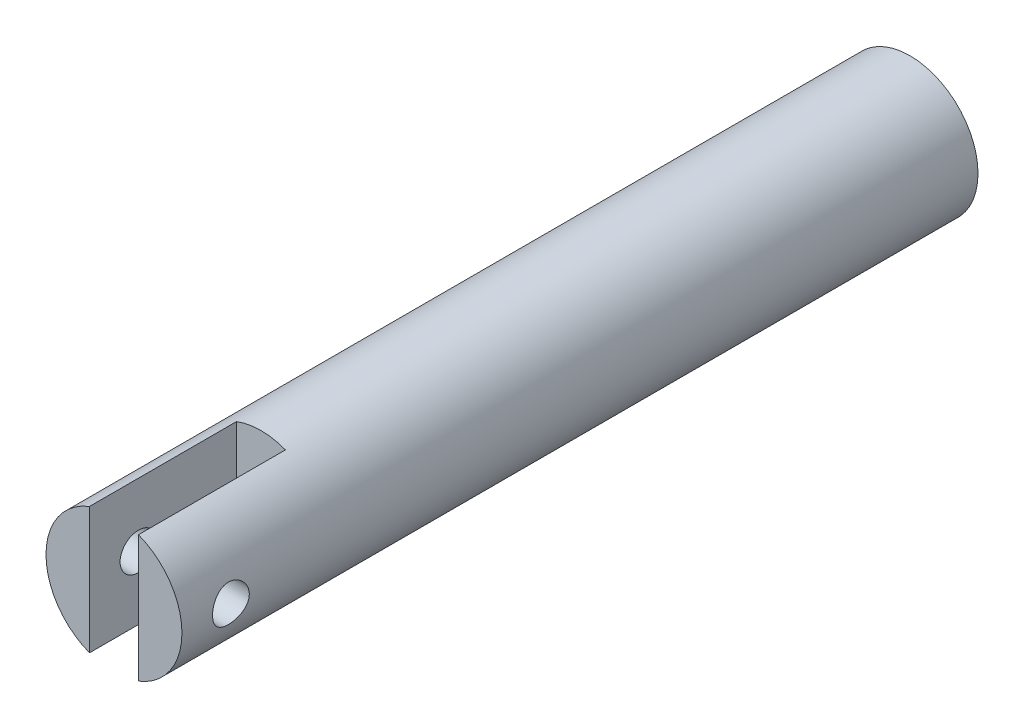
ISO-10303-21;
HEADER;
FILE_DESCRIPTION(('STEP AP214'),'2;1');
FILE_NAME('part.step','',(''),(''),'','','');
FILE_SCHEMA(('AUTOMOTIVE_DESIGN { 1 0 10303 214 1 1 1 1 }'));
ENDSEC;
DATA;
#1=APPLICATION_CONTEXT('core data for automotive mechanical design processes');
#2=APPLICATION_PROTOCOL_DEFINITION('international standard','automotive_design',2000,#1);
#3=PRODUCT_CONTEXT('',#1,'mechanical');
#4=PRODUCT('Part','Part','',(#3));
#5=PRODUCT_RELATED_PRODUCT_CATEGORY('part','',(#4));
#6=PRODUCT_DEFINITION_FORMATION('','',#4);
#7=PRODUCT_DEFINITION_CONTEXT('part definition',#1,'design');
#8=PRODUCT_DEFINITION('design','',#6,#7);
#9=PRODUCT_DEFINITION_SHAPE('','',#8);
#10=(LENGTH_UNIT() NAMED_UNIT(*) SI_UNIT(.MILLI.,.METRE.));
#11=(NAMED_UNIT(*) PLANE_ANGLE_UNIT() SI_UNIT($,.RADIAN.));
#12=(NAMED_UNIT(*) SI_UNIT($,.STERADIAN.) SOLID_ANGLE_UNIT());
#13=UNCERTAINTY_MEASURE_WITH_UNIT(LENGTH_MEASURE(1.E-05),#10,'distance_accuracy_value','');
#14=(GEOMETRIC_REPRESENTATION_CONTEXT(3) GLOBAL_UNCERTAINTY_ASSIGNED_CONTEXT((#13)) GLOBAL_UNIT_ASSIGNED_CONTEXT((#10,
#11,#12)) REPRESENTATION_CONTEXT('',''));
#15=CARTESIAN_POINT('',(0.,0.,0.));
#16=DIRECTION('',(0.,0.,1.));
#17=DIRECTION('',(1.,0.,0.));
#18=AXIS2_PLACEMENT_3D('',#15,#16,#17);
#19=CARTESIAN_POINT('',(0.,0.,65.));
#20=DIRECTION('',(0.,0.,1.));
#21=DIRECTION('',(1.,0.,0.));
#22=AXIS2_PLACEMENT_3D('',#19,#20,#21);
#23=PLANE('',#22);
#24=DIRECTION('',(0.,-1.,0.));
#25=VECTOR('',#24,1.);
#26=CARTESIAN_POINT('',(-2.,5.17711309515255,65.));
#27=LINE('',#26,#25);
#28=CARTESIAN_POINT('',(-2.,5.17711309515255,65.));
#29=VERTEX_POINT('',#28);
#30=CARTESIAN_POINT('',(-2.,-5.17711309515255,65.));
#31=VERTEX_POINT('',#30);
#32=EDGE_CURVE('E73',#29,#31,#27,.T.);
#33=ORIENTED_EDGE('',*,*,#32,.F.);
#34=CARTESIAN_POINT('',(0.,0.,65.));
#35=DIRECTION('',(0.,0.,1.));
#36=DIRECTION('',(1.,0.,0.));
#37=AXIS2_PLACEMENT_3D('',#34,#35,#36);
#38=CIRCLE('',#37,5.55);
#39=EDGE_CURVE('E11',#29,#31,#38,.T.);
#40=ORIENTED_EDGE('',*,*,#39,.T.);
#41=EDGE_LOOP('',(#33,#40));
#42=FACE_BOUND('',#41,.T.);
#43=ADVANCED_FACE('F32',(#42),#23,.T.);
#44=CARTESIAN_POINT('',(0.,0.,65.));
#45=DIRECTION('',(0.,0.,-1.));
#46=DIRECTION('',(-1.,0.,0.));
#47=AXIS2_PLACEMENT_3D('',#44,#45,#46);
#48=CYLINDRICAL_SURFACE('',#47,5.55);
#49=CARTESIAN_POINT('',(-5.55,0.,59.5));
#50=CARTESIAN_POINT('',(-5.54999879615194,0.0826494633927154,59.5000018746962));
#51=CARTESIAN_POINT('',(-5.54813568532362,0.165318848419868,59.506853812904));
#52=CARTESIAN_POINT('',(-5.54088440898738,0.328273451632411,59.5340303315248));
#53=CARTESIAN_POINT('',(-5.53549461428784,0.408557549979276,59.5543611387117));
#54=CARTESIAN_POINT('',(-5.52178442124985,0.564366049193908,59.6077840939381));
#55=CARTESIAN_POINT('',(-5.51346785987332,0.639896529910036,59.6408595392463));
#56=CARTESIAN_POINT('',(-5.49478153503013,0.784338444058895,59.7187702709216));
#57=CARTESIAN_POINT('',(-5.48441162002809,0.85324938841894,59.7636064252962));
#58=CARTESIAN_POINT('',(-5.46246127093075,0.984133559937081,59.8648904757167));
#59=CARTESIAN_POINT('',(-5.45085970647635,1.04592709324454,59.9215660045104));
#60=CARTESIAN_POINT('',(-5.42788828388297,1.15925819722945,60.0444335444044));
#61=CARTESIAN_POINT('',(-5.41651845661983,1.21079440917286,60.1106268142728));
#62=CARTESIAN_POINT('',(-5.39508096210617,1.30303115342026,60.2520939917978));
#63=CARTESIAN_POINT('',(-5.38503991518082,1.34352367385294,60.3275079287304));
#64=CARTESIAN_POINT('',(-5.36770808081144,1.41118330571831,60.4843887684982));
#65=CARTESIAN_POINT('',(-5.36041677093315,1.43835294871614,60.5658545179994));
#66=CARTESIAN_POINT('',(-5.34962833164668,1.47796903905552,60.7305333611906));
#67=CARTESIAN_POINT('',(-5.34604724875154,1.49074186800391,60.8136623033563));
#68=CARTESIAN_POINT('',(-5.34283400169016,1.50221948422755,60.9809542865722));
#69=CARTESIAN_POINT('',(-5.34320107787369,1.50092697775977,61.0651171255816));
#70=CARTESIAN_POINT('',(-5.34776761089798,1.48456944039451,61.2295297086572));
#71=CARTESIAN_POINT('',(-5.35185678021551,1.46990073062952,61.3098224354498));
#72=CARTESIAN_POINT('',(-5.36322997341351,1.42784250780183,61.4667624758096));
#73=CARTESIAN_POINT('',(-5.37051425881699,1.40045195343429,61.5434094904027));
#74=CARTESIAN_POINT('',(-5.38755296870838,1.3334078704218,61.6919088355209));
#75=CARTESIAN_POINT('',(-5.39733492625185,1.29361648626527,61.7636956347143));
#76=CARTESIAN_POINT('',(-5.41825216289466,1.20299640255253,61.8997117370747));
#77=CARTESIAN_POINT('',(-5.429387714712,1.1521654771554,61.9639395121253));
#78=CARTESIAN_POINT('',(-5.45221531507438,1.03888875462571,62.0852771073868));
#79=CARTESIAN_POINT('',(-5.46391350077369,0.976110532435758,62.1420758788547));
#80=CARTESIAN_POINT('',(-5.48621371709655,0.841776678813462,62.2444039738118));
#81=CARTESIAN_POINT('',(-5.49681570215022,0.770220682752514,62.2899328289116));
#82=CARTESIAN_POINT('',(-5.51579714245651,0.619872258080171,62.3685708376427));
#83=CARTESIAN_POINT('',(-5.5241662411197,0.541048315268525,62.4016224029782));
#84=CARTESIAN_POINT('',(-5.53766413798729,0.37868461864081,62.4539145573887));
#85=CARTESIAN_POINT('',(-5.54279366413402,0.295145928842746,62.4731582492697));
#86=CARTESIAN_POINT('',(-5.54912384681125,0.128377573772656,62.4967970008638));
#87=CARTESIAN_POINT('',(-5.5504363277452,0.0452119855218677,62.5016148108581));
#88=CARTESIAN_POINT('',(-5.54930671534324,-0.120739317200337,62.4974343088602));
#89=CARTESIAN_POINT('',(-5.54686502145572,-0.203525071146549,62.4884374667625));
#90=CARTESIAN_POINT('',(-5.53857375333191,-0.364848942531915,62.4572293591669));
#91=CARTESIAN_POINT('',(-5.53278532499192,-0.443436330325438,62.435255045592));
#92=CARTESIAN_POINT('',(-5.51845832017505,-0.595800840535774,62.378991941288));
#93=CARTESIAN_POINT('',(-5.50991944162924,-0.669577433535165,62.3447017979219));
#94=CARTESIAN_POINT('',(-5.49077807060945,-0.811859862642032,62.2640040455767));
#95=CARTESIAN_POINT('',(-5.48013775012766,-0.880230910060631,62.2173679825496));
#96=CARTESIAN_POINT('',(-5.45802286326308,-1.00832472838278,62.1135883880366));
#97=CARTESIAN_POINT('',(-5.44654812774349,-1.06804573853389,62.0564427226339));
#98=CARTESIAN_POINT('',(-5.42364433808291,-1.17893417351261,61.9312913887765));
#99=CARTESIAN_POINT('',(-5.41222627781712,-1.22980300036862,61.8630186397425));
#100=CARTESIAN_POINT('',(-5.39109349586186,-1.31936978116537,61.7186634174368));
#101=CARTESIAN_POINT('',(-5.38137870475979,-1.35806823113139,61.6425812626188));
#102=CARTESIAN_POINT('',(-5.3648647316121,-1.42190514266968,61.4851369239655));
#103=CARTESIAN_POINT('',(-5.35804890811988,-1.44712122035433,61.4038080506478));
#104=CARTESIAN_POINT('',(-5.34810458208024,-1.48345508406507,61.2378480302932));
#105=CARTESIAN_POINT('',(-5.34497510580962,-1.49457659313316,61.1532177614018));
#106=CARTESIAN_POINT('',(-5.34284070068284,-1.50218723372163,60.9861187129008));
#107=CARTESIAN_POINT('',(-5.3437003024775,-1.49915693877548,60.9036732285872));
#108=CARTESIAN_POINT('',(-5.34912914015623,-1.47966808775349,60.7405157803563));
#109=CARTESIAN_POINT('',(-5.35369827560105,-1.463209895251,60.6598037695642));
#110=CARTESIAN_POINT('',(-5.36594961229916,-1.4176145187469,60.5030277270834));
#111=CARTESIAN_POINT('',(-5.37360613355019,-1.38858178212087,60.426931170208));
#112=CARTESIAN_POINT('',(-5.39116955463475,-1.3187424295426,60.2806309729558));
#113=CARTESIAN_POINT('',(-5.40107681611949,-1.27793392116245,60.2104282820968));
#114=CARTESIAN_POINT('',(-5.42239869846201,-1.18425604648313,60.0756211641228));
#115=CARTESIAN_POINT('',(-5.43384977433815,-1.13105999285312,60.0112494924036));
#116=CARTESIAN_POINT('',(-5.45676839722498,-1.01473492702236,59.8921904291386));
#117=CARTESIAN_POINT('',(-5.46823594757932,-0.951603488480783,59.8375054101423));
#118=CARTESIAN_POINT('',(-5.49019935014915,-0.815512191776865,59.7381791110337));
#119=CARTESIAN_POINT('',(-5.5006680449896,-0.742365569701441,59.6937871970298));
#120=CARTESIAN_POINT('',(-5.51915451258881,-0.589366695549458,59.6179997935478));
#121=CARTESIAN_POINT('',(-5.52717381491222,-0.509518668160427,59.5865961889431));
#122=CARTESIAN_POINT('',(-5.53885482984226,-0.358337261031642,59.5416438492013));
#123=CARTESIAN_POINT('',(-5.54300340741267,-0.287638783374459,59.5260642669616));
#124=CARTESIAN_POINT('',(-5.54857637665883,-0.144631842519288,59.5052420630478));
#125=CARTESIAN_POINT('',(-5.55000105344379,-0.0723235486214627,59.4999983595213));
#126=CARTESIAN_POINT('',(-5.55,0.,59.5));
#127=B_SPLINE_CURVE_WITH_KNOTS('',3,(#49,#50,#51,#52,#53,#54,#55,#56,#57,#58,#59,#60,#61,#62,
#63,#64,#65,#66,#67,#68,#69,#70,#71,#72,#73,#74,#75,#76,#77,#78,#79,#80,#81,#82,#83,#84,#85,#86,
#87,#88,#89,#90,#91,#92,#93,#94,#95,#96,#97,#98,#99,#100,#101,#102,#103,#104,#105,#106,#107,
#108,#109,#110,#111,#112,#113,#114,#115,#116,#117,#118,#119,#120,#121,#122,#123,#124,#125,#126),
.UNSPECIFIED.,.T.,.F.,(4,2,2,2,2,2,2,2,2,2,2,2,2,2,2,2,2,2,2,2,2,2,2,2,2,2,2,2,2,2,2,2,2,2,2,2,
2,2,4),(0.,0.247683117479802,0.495480735843709,0.742954696811896,0.990446927913596,
1.24322718642299,1.49604090716615,1.75333091968523,2.01057202392053,2.26185607755089,
2.51309178343998,2.75711729570227,3.0011627853929,3.24802431731499,3.49493566883073,
3.75012973834969,4.00533441221877,4.26170297346541,4.51801390735887,4.76673633023641,
5.01543229060086,5.25972195861126,5.50403846495144,5.75323722720833,6.00248664387578,
6.25897090131834,6.51544470393504,6.77042567663096,7.02533928274809,7.27166059273816,
7.51797523356144,7.76228202195334,8.0066280936063,8.2583449745939,8.51012342354435,
8.76748013023476,9.02467579604023,9.24143700090325,9.45817551624786),.UNSPECIFIED.);
#128=CARTESIAN_POINT('',(-5.55,0.,59.5));
#129=VERTEX_POINT('',#128);
#130=EDGE_CURVE('E104',#129,#129,#127,.T.);
#131=ORIENTED_EDGE('',*,*,#130,.T.);
#132=EDGE_LOOP('',(#131));
#133=FACE_BOUND('',#132,.T.);
#134=CARTESIAN_POINT('',(5.55,0.,59.5));
#135=CARTESIAN_POINT('',(5.54999879615194,-0.0826494633927154,59.5000018746962));
#136=CARTESIAN_POINT('',(5.54813568532362,-0.165318848419868,59.506853812904));
#137=CARTESIAN_POINT('',(5.54088440898738,-0.328273451632411,59.5340303315248));
#138=CARTESIAN_POINT('',(5.53549461428784,-0.408557549979276,59.5543611387117));
#139=CARTESIAN_POINT('',(5.52178442124985,-0.564366049193908,59.6077840939381));
#140=CARTESIAN_POINT('',(5.51346785987332,-0.639896529910036,59.6408595392463));
#141=CARTESIAN_POINT('',(5.49478153503013,-0.784338444058895,59.7187702709216));
#142=CARTESIAN_POINT('',(5.48441162002809,-0.85324938841894,59.7636064252962));
#143=CARTESIAN_POINT('',(5.46246127093075,-0.984133559937081,59.8648904757167));
#144=CARTESIAN_POINT('',(5.45085970647635,-1.04592709324454,59.9215660045104));
#145=CARTESIAN_POINT('',(5.42788828388297,-1.15925819722945,60.0444335444044));
#146=CARTESIAN_POINT('',(5.41651845661983,-1.21079440917286,60.1106268142728));
#147=CARTESIAN_POINT('',(5.39508096210617,-1.30303115342026,60.2520939917978));
#148=CARTESIAN_POINT('',(5.38503991518082,-1.34352367385294,60.3275079287304));
#149=CARTESIAN_POINT('',(5.36770808081144,-1.41118330571831,60.4843887684982));
#150=CARTESIAN_POINT('',(5.36041677093315,-1.43835294871614,60.5658545179994));
#151=CARTESIAN_POINT('',(5.34962833164668,-1.47796903905552,60.7305333611906));
#152=CARTESIAN_POINT('',(5.34604724875154,-1.49074186800391,60.8136623033563));
#153=CARTESIAN_POINT('',(5.34283400169016,-1.50221948422755,60.9809542865722));
#154=CARTESIAN_POINT('',(5.34320107787369,-1.50092697775977,61.0651171255816));
#155=CARTESIAN_POINT('',(5.34776761089798,-1.48456944039451,61.2295297086572));
#156=CARTESIAN_POINT('',(5.35185678021551,-1.46990073062952,61.3098224354498));
#157=CARTESIAN_POINT('',(5.36322997341351,-1.42784250780183,61.4667624758096));
#158=CARTESIAN_POINT('',(5.37051425881699,-1.40045195343429,61.5434094904027));
#159=CARTESIAN_POINT('',(5.38755296870838,-1.3334078704218,61.6919088355209));
#160=CARTESIAN_POINT('',(5.39733492625185,-1.29361648626527,61.7636956347143));
#161=CARTESIAN_POINT('',(5.41825216289466,-1.20299640255253,61.8997117370747));
#162=CARTESIAN_POINT('',(5.429387714712,-1.1521654771554,61.9639395121253));
#163=CARTESIAN_POINT('',(5.45221531507438,-1.03888875462571,62.0852771073868));
#164=CARTESIAN_POINT('',(5.46391350077369,-0.976110532435758,62.1420758788547));
#165=CARTESIAN_POINT('',(5.48621371709655,-0.841776678813462,62.2444039738118));
#166=CARTESIAN_POINT('',(5.49681570215022,-0.770220682752514,62.2899328289116));
#167=CARTESIAN_POINT('',(5.51579714245651,-0.619872258080171,62.3685708376427));
#168=CARTESIAN_POINT('',(5.5241662411197,-0.541048315268525,62.4016224029782));
#169=CARTESIAN_POINT('',(5.53766413798729,-0.37868461864081,62.4539145573887));
#170=CARTESIAN_POINT('',(5.54279366413402,-0.295145928842746,62.4731582492697));
#171=CARTESIAN_POINT('',(5.54912384681125,-0.128377573772656,62.4967970008638));
#172=CARTESIAN_POINT('',(5.5504363277452,-0.0452119855218677,62.5016148108581));
#173=CARTESIAN_POINT('',(5.54930671534324,0.120739317200337,62.4974343088602));
#174=CARTESIAN_POINT('',(5.54686502145572,0.203525071146549,62.4884374667625));
#175=CARTESIAN_POINT('',(5.53857375333191,0.364848942531915,62.4572293591669));
#176=CARTESIAN_POINT('',(5.53278532499192,0.443436330325438,62.435255045592));
#177=CARTESIAN_POINT('',(5.51845832017505,0.595800840535774,62.378991941288));
#178=CARTESIAN_POINT('',(5.50991944162924,0.669577433535165,62.3447017979219));
#179=CARTESIAN_POINT('',(5.49077807060945,0.811859862642032,62.2640040455767));
#180=CARTESIAN_POINT('',(5.48013775012766,0.880230910060631,62.2173679825496));
#181=CARTESIAN_POINT('',(5.45802286326308,1.00832472838278,62.1135883880366));
#182=CARTESIAN_POINT('',(5.44654812774349,1.06804573853389,62.0564427226339));
#183=CARTESIAN_POINT('',(5.42364433808291,1.17893417351261,61.9312913887765));
#184=CARTESIAN_POINT('',(5.41222627781712,1.22980300036862,61.8630186397425));
#185=CARTESIAN_POINT('',(5.39109349586186,1.31936978116537,61.7186634174368));
#186=CARTESIAN_POINT('',(5.38137870475979,1.35806823113139,61.6425812626188));
#187=CARTESIAN_POINT('',(5.3648647316121,1.42190514266968,61.4851369239655));
#188=CARTESIAN_POINT('',(5.35804890811988,1.44712122035433,61.4038080506478));
#189=CARTESIAN_POINT('',(5.34810458208024,1.48345508406507,61.2378480302932));
#190=CARTESIAN_POINT('',(5.34497510580962,1.49457659313316,61.1532177614018));
#191=CARTESIAN_POINT('',(5.34284070068284,1.50218723372163,60.9861187129008));
#192=CARTESIAN_POINT('',(5.3437003024775,1.49915693877548,60.9036732285872));
#193=CARTESIAN_POINT('',(5.34912914015623,1.47966808775349,60.7405157803563));
#194=CARTESIAN_POINT('',(5.35369827560105,1.463209895251,60.6598037695642));
#195=CARTESIAN_POINT('',(5.36594961229916,1.4176145187469,60.5030277270834));
#196=CARTESIAN_POINT('',(5.37360613355019,1.38858178212087,60.426931170208));
#197=CARTESIAN_POINT('',(5.39116955463475,1.3187424295426,60.2806309729558));
#198=CARTESIAN_POINT('',(5.40107681611949,1.27793392116245,60.2104282820968));
#199=CARTESIAN_POINT('',(5.42239869846201,1.18425604648313,60.0756211641228));
#200=CARTESIAN_POINT('',(5.43384977433815,1.13105999285312,60.0112494924036));
#201=CARTESIAN_POINT('',(5.45676839722498,1.01473492702236,59.8921904291386));
#202=CARTESIAN_POINT('',(5.46823594757932,0.951603488480783,59.8375054101423));
#203=CARTESIAN_POINT('',(5.49019935014915,0.815512191776865,59.7381791110337));
#204=CARTESIAN_POINT('',(5.5006680449896,0.742365569701441,59.6937871970298));
#205=CARTESIAN_POINT('',(5.51915451258881,0.589366695549458,59.6179997935478));
#206=CARTESIAN_POINT('',(5.52717381491222,0.509518668160427,59.5865961889431));
#207=CARTESIAN_POINT('',(5.53885482984226,0.358337261031642,59.5416438492013));
#208=CARTESIAN_POINT('',(5.54300340741267,0.287638783374459,59.5260642669616));
#209=CARTESIAN_POINT('',(5.54857637665883,0.144631842519288,59.5052420630478));
#210=CARTESIAN_POINT('',(5.55000105344379,0.0723235486214627,59.4999983595213));
#211=CARTESIAN_POINT('',(5.55,0.,59.5));
#212=B_SPLINE_CURVE_WITH_KNOTS('',3,(#134,#135,#136,#137,#138,#139,#140,#141,#142,#143,#144,
#145,#146,#147,#148,#149,#150,#151,#152,#153,#154,#155,#156,#157,#158,#159,#160,#161,#162,#163,
#164,#165,#166,#167,#168,#169,#170,#171,#172,#173,#174,#175,#176,#177,#178,#179,#180,#181,#182,
#183,#184,#185,#186,#187,#188,#189,#190,#191,#192,#193,#194,#195,#196,#197,#198,#199,#200,#201,
#202,#203,#204,#205,#206,#207,#208,#209,#210,#211),.UNSPECIFIED.,.T.,.F.,(4,2,2,2,2,2,2,2,2,2,2,
2,2,2,2,2,2,2,2,2,2,2,2,2,2,2,2,2,2,2,2,2,2,2,2,2,2,2,4),(0.,0.247683117479802,
0.495480735843709,0.742954696811896,0.990446927913596,1.24322718642299,1.49604090716615,
1.75333091968523,2.01057202392053,2.26185607755089,2.51309178343998,2.75711729570227,
3.0011627853929,3.24802431731499,3.49493566883073,3.75012973834969,4.00533441221877,
4.26170297346541,4.51801390735887,4.76673633023641,5.01543229060086,5.25972195861126,
5.50403846495144,5.75323722720833,6.00248664387578,6.25897090131834,6.51544470393504,
6.77042567663096,7.02533928274809,7.27166059273816,7.51797523356144,7.76228202195334,
8.0066280936063,8.2583449745939,8.51012342354435,8.76748013023476,9.02467579604023,
9.24143700090325,9.45817551624786),.UNSPECIFIED.);
#213=CARTESIAN_POINT('',(5.55,0.,59.5));
#214=VERTEX_POINT('',#213);
#215=EDGE_CURVE('E143',#214,#214,#212,.T.);
#216=ORIENTED_EDGE('',*,*,#215,.T.);
#217=EDGE_LOOP('',(#216));
#218=FACE_BOUND('',#217,.T.);
#219=ORIENTED_EDGE('',*,*,#39,.F.);
#220=DIRECTION('',(0.,0.,1.));
#221=VECTOR('',#220,1.);
#222=CARTESIAN_POINT('',(-2.,5.17711309515255,53.));
#223=LINE('',#222,#221);
#224=CARTESIAN_POINT('',(-2.,5.17711309515255,53.));
#225=VERTEX_POINT('',#224);
#226=EDGE_CURVE('E87',#225,#29,#223,.T.);
#227=ORIENTED_EDGE('',*,*,#226,.F.);
#228=CARTESIAN_POINT('',(0.,0.,53.));
#229=DIRECTION('',(0.,0.,1.));
#230=DIRECTION('',(1.,0.,0.));
#231=AXIS2_PLACEMENT_3D('',#228,#229,#230);
#232=CIRCLE('',#231,5.55);
#233=CARTESIAN_POINT('',(2.,5.17711309515255,53.));
#234=VERTEX_POINT('',#233);
#235=EDGE_CURVE('E91',#234,#225,#232,.T.);
#236=ORIENTED_EDGE('',*,*,#235,.F.);
#237=DIRECTION('',(0.,0.,1.));
#238=VECTOR('',#237,1.);
#239=CARTESIAN_POINT('',(2.,5.17711309515255,53.));
#240=LINE('',#239,#238);
#241=CARTESIAN_POINT('',(2.,5.17711309515255,65.));
#242=VERTEX_POINT('',#241);
#243=EDGE_CURVE('E80',#234,#242,#240,.T.);
#244=ORIENTED_EDGE('',*,*,#243,.T.);
#245=CARTESIAN_POINT('',(2.,-5.17711309515255,65.));
#246=VERTEX_POINT('',#245);
#247=EDGE_CURVE('E42',#246,#242,#38,.T.);
#248=ORIENTED_EDGE('',*,*,#247,.F.);
#249=DIRECTION('',(0.,0.,1.));
#250=VECTOR('',#249,1.);
#251=CARTESIAN_POINT('',(2.,-5.17711309515255,53.));
#252=LINE('',#251,#250);
#253=CARTESIAN_POINT('',(2.,-5.17711309515255,53.));
#254=VERTEX_POINT('',#253);
#255=EDGE_CURVE('E50',#254,#246,#252,.T.);
#256=ORIENTED_EDGE('',*,*,#255,.F.);
#257=CARTESIAN_POINT('',(0.,0.,53.));
#258=DIRECTION('',(0.,0.,1.));
#259=DIRECTION('',(1.,0.,0.));
#260=AXIS2_PLACEMENT_3D('',#257,#258,#259);
#261=CIRCLE('',#260,5.55);
#262=CARTESIAN_POINT('',(-2.,-5.17711309515255,53.));
#263=VERTEX_POINT('',#262);
#264=EDGE_CURVE('E93',#263,#254,#261,.T.);
#265=ORIENTED_EDGE('',*,*,#264,.F.);
#266=DIRECTION('',(0.,0.,1.));
#267=VECTOR('',#266,1.);
#268=CARTESIAN_POINT('',(-2.,-5.17711309515255,53.));
#269=LINE('',#268,#267);
#270=EDGE_CURVE('E59',#263,#31,#269,.T.);
#271=ORIENTED_EDGE('',*,*,#270,.T.);
#272=EDGE_LOOP('',(#219,#227,#236,#244,#248,#256,#265,#271));
#273=FACE_BOUND('',#272,.T.);
#274=CARTESIAN_POINT('',(0.,0.,0.));
#275=DIRECTION('',(0.,0.,1.));
#276=DIRECTION('',(1.,0.,0.));
#277=AXIS2_PLACEMENT_3D('',#274,#275,#276);
#278=CIRCLE('',#277,5.55);
#279=CARTESIAN_POINT('',(5.55,0.,0.));
#280=VERTEX_POINT('',#279);
#281=EDGE_CURVE('E107',#280,#280,#278,.T.);
#282=ORIENTED_EDGE('',*,*,#281,.T.);
#283=EDGE_LOOP('',(#282));
#284=FACE_BOUND('',#283,.T.);
#285=ADVANCED_FACE('F34',(#133,#218,#273,#284),#48,.T.);
#286=DIRECTION('',(0.,1.,0.));
#287=VECTOR('',#286,1.);
#288=CARTESIAN_POINT('',(2.,5.17711309515255,65.));
#289=LINE('',#288,#287);
#290=EDGE_CURVE('E82',#246,#242,#289,.T.);
#291=ORIENTED_EDGE('',*,*,#290,.F.);
#292=ORIENTED_EDGE('',*,*,#247,.T.);
#293=EDGE_LOOP('',(#291,#292));
#294=FACE_BOUND('',#293,.T.);
#295=ADVANCED_FACE('F115',(#294),#23,.T.);
#296=CARTESIAN_POINT('',(0.,0.,0.));
#297=DIRECTION('',(0.,0.,1.));
#298=DIRECTION('',(1.,0.,0.));
#299=AXIS2_PLACEMENT_3D('',#296,#297,#298);
#300=PLANE('',#299);
#301=ORIENTED_EDGE('',*,*,#281,.F.);
#302=EDGE_LOOP('',(#301));
#303=FACE_BOUND('',#302,.T.);
#304=ADVANCED_FACE('F112',(#303),#300,.F.);
#305=CARTESIAN_POINT('',(-2.,5.17711309515255,53.));
#306=DIRECTION('',(-1.,0.,0.));
#307=DIRECTION('',(0.,0.,1.));
#308=AXIS2_PLACEMENT_3D('',#305,#306,#307);
#309=PLANE('',#308);
#310=CARTESIAN_POINT('',(-2.,0.,61.));
#311=DIRECTION('',(-1.,0.,0.));
#312=DIRECTION('',(0.,0.,1.));
#313=AXIS2_PLACEMENT_3D('',#310,#311,#312);
#314=CIRCLE('',#313,1.5);
#315=CARTESIAN_POINT('',(-2.,0.,62.5));
#316=VERTEX_POINT('',#315);
#317=EDGE_CURVE('E155',#316,#316,#314,.T.);
#318=ORIENTED_EDGE('',*,*,#317,.T.);
#319=EDGE_LOOP('',(#318));
#320=FACE_BOUND('',#319,.T.);
#321=ORIENTED_EDGE('',*,*,#32,.T.);
#322=ORIENTED_EDGE('',*,*,#270,.F.);
#323=DIRECTION('',(0.,-1.,0.));
#324=VECTOR('',#323,1.);
#325=CARTESIAN_POINT('',(-2.,5.17711309515255,53.));
#326=LINE('',#325,#324);
#327=EDGE_CURVE('E98',#225,#263,#326,.T.);
#328=ORIENTED_EDGE('',*,*,#327,.F.);
#329=ORIENTED_EDGE('',*,*,#226,.T.);
#330=EDGE_LOOP('',(#321,#322,#328,#329));
#331=FACE_BOUND('',#330,.T.);
#332=ADVANCED_FACE('F114',(#320,#331),#309,.F.);
#333=CARTESIAN_POINT('',(2.,5.17711309515255,53.));
#334=DIRECTION('',(1.,0.,0.));
#335=DIRECTION('',(0.,0.,-1.));
#336=AXIS2_PLACEMENT_3D('',#333,#334,#335);
#337=PLANE('',#336);
#338=CARTESIAN_POINT('',(2.,0.,61.));
#339=DIRECTION('',(1.,0.,0.));
#340=DIRECTION('',(0.,0.,-1.));
#341=AXIS2_PLACEMENT_3D('',#338,#339,#340);
#342=CIRCLE('',#341,1.5);
#343=CARTESIAN_POINT('',(2.,0.,59.5));
#344=VERTEX_POINT('',#343);
#345=EDGE_CURVE('E37',#344,#344,#342,.T.);
#346=ORIENTED_EDGE('',*,*,#345,.T.);
#347=EDGE_LOOP('',(#346));
#348=FACE_BOUND('',#347,.T.);
#349=ORIENTED_EDGE('',*,*,#290,.T.);
#350=ORIENTED_EDGE('',*,*,#243,.F.);
#351=DIRECTION('',(0.,1.,0.));
#352=VECTOR('',#351,1.);
#353=CARTESIAN_POINT('',(2.,5.17711309515255,53.));
#354=LINE('',#353,#352);
#355=EDGE_CURVE('E77',#254,#234,#354,.T.);
#356=ORIENTED_EDGE('',*,*,#355,.F.);
#357=ORIENTED_EDGE('',*,*,#255,.T.);
#358=EDGE_LOOP('',(#349,#350,#356,#357));
#359=FACE_BOUND('',#358,.T.);
#360=ADVANCED_FACE('F81',(#348,#359),#337,.F.);
#361=CARTESIAN_POINT('',(0.,0.,53.));
#362=DIRECTION('',(0.,0.,1.));
#363=DIRECTION('',(1.,0.,0.));
#364=AXIS2_PLACEMENT_3D('',#361,#362,#363);
#365=PLANE('',#364);
#366=ORIENTED_EDGE('',*,*,#264,.T.);
#367=ORIENTED_EDGE('',*,*,#355,.T.);
#368=ORIENTED_EDGE('',*,*,#235,.T.);
#369=ORIENTED_EDGE('',*,*,#327,.T.);
#370=EDGE_LOOP('',(#366,#367,#368,#369));
#371=FACE_BOUND('',#370,.T.);
#372=ADVANCED_FACE('F90',(#371),#365,.T.);
#373=CARTESIAN_POINT('',(-5.55,0.,61.));
#374=DIRECTION('',(1.,0.,0.));
#375=DIRECTION('',(0.,0.,-1.));
#376=AXIS2_PLACEMENT_3D('',#373,#374,#375);
#377=CYLINDRICAL_SURFACE('',#376,1.5);
#378=ORIENTED_EDGE('',*,*,#345,.F.);
#379=EDGE_LOOP('',(#378));
#380=FACE_BOUND('',#379,.T.);
#381=ORIENTED_EDGE('',*,*,#215,.F.);
#382=EDGE_LOOP('',(#381));
#383=FACE_BOUND('',#382,.T.);
#384=ADVANCED_FACE('F136',(#380,#383),#377,.F.);
#385=ORIENTED_EDGE('',*,*,#317,.F.);
#386=EDGE_LOOP('',(#385));
#387=FACE_BOUND('',#386,.T.);
#388=ORIENTED_EDGE('',*,*,#130,.F.);
#389=EDGE_LOOP('',(#388));
#390=FACE_BOUND('',#389,.T.);
#391=ADVANCED_FACE('F137',(#387,#390),#377,.F.);
#392=CLOSED_SHELL('',(#43,#285,#295,#304,#332,#360,#372,#384,#391));
#393=MANIFOLD_SOLID_BREP('B2',#392);
#394=ADVANCED_BREP_SHAPE_REPRESENTATION('',(#18,#393),#14);
#395=SHAPE_DEFINITION_REPRESENTATION(#9,#394);
ENDSEC;
END-ISO-10303-21;
